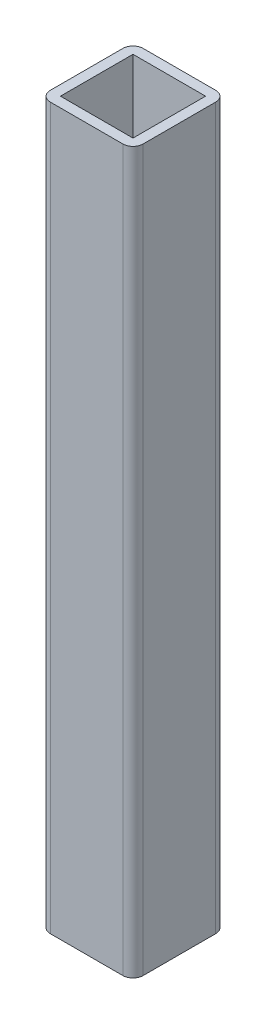
ISO-10303-21;
HEADER;
FILE_DESCRIPTION(('STEP AP214'),'2;1');
FILE_NAME('part.step','',(''),(''),'','','');
FILE_SCHEMA(('AUTOMOTIVE_DESIGN { 1 0 10303 214 1 1 1 1 }'));
ENDSEC;
DATA;
#1=APPLICATION_CONTEXT('core data for automotive mechanical design processes');
#2=APPLICATION_PROTOCOL_DEFINITION('international standard','automotive_design',2000,#1);
#3=PRODUCT_CONTEXT('',#1,'mechanical');
#4=PRODUCT('Part','Part','',(#3));
#5=PRODUCT_RELATED_PRODUCT_CATEGORY('part','',(#4));
#6=PRODUCT_DEFINITION_FORMATION('','',#4);
#7=PRODUCT_DEFINITION_CONTEXT('part definition',#1,'design');
#8=PRODUCT_DEFINITION('design','',#6,#7);
#9=PRODUCT_DEFINITION_SHAPE('','',#8);
#10=(LENGTH_UNIT() NAMED_UNIT(*) SI_UNIT(.MILLI.,.METRE.));
#11=(NAMED_UNIT(*) PLANE_ANGLE_UNIT() SI_UNIT($,.RADIAN.));
#12=(NAMED_UNIT(*) SI_UNIT($,.STERADIAN.) SOLID_ANGLE_UNIT());
#13=UNCERTAINTY_MEASURE_WITH_UNIT(LENGTH_MEASURE(1.E-05),#10,'distance_accuracy_value','');
#14=(GEOMETRIC_REPRESENTATION_CONTEXT(3) GLOBAL_UNCERTAINTY_ASSIGNED_CONTEXT((#13)) GLOBAL_UNIT_ASSIGNED_CONTEXT((#10,
#11,#12)) REPRESENTATION_CONTEXT('',''));
#15=CARTESIAN_POINT('',(0.,0.,0.));
#16=DIRECTION('',(0.,0.,1.));
#17=DIRECTION('',(1.,0.,0.));
#18=AXIS2_PLACEMENT_3D('',#15,#16,#17);
#19=CARTESIAN_POINT('',(22.8,198.5,2.8));
#20=DIRECTION('',(0.,-1.,0.));
#21=DIRECTION('',(0.,0.,-1.));
#22=AXIS2_PLACEMENT_3D('',#19,#20,#21);
#23=CYLINDRICAL_SURFACE('',#22,2.8);
#24=CARTESIAN_POINT('',(22.8,0.,2.8));
#25=DIRECTION('',(0.,1.,0.));
#26=DIRECTION('',(0.,0.,-1.));
#27=AXIS2_PLACEMENT_3D('',#24,#25,#26);
#28=CIRCLE('',#27,2.8);
#29=CARTESIAN_POINT('',(25.6,0.,2.80000000000002));
#30=VERTEX_POINT('',#29);
#31=CARTESIAN_POINT('',(22.8,0.,0.));
#32=VERTEX_POINT('',#31);
#33=EDGE_CURVE('E157',#30,#32,#28,.T.);
#34=ORIENTED_EDGE('',*,*,#33,.T.);
#35=DIRECTION('',(0.,-1.,0.));
#36=VECTOR('',#35,1.);
#37=CARTESIAN_POINT('',(22.8,198.5,0.));
#38=LINE('',#37,#36);
#39=CARTESIAN_POINT('',(22.8,198.5,0.));
#40=VERTEX_POINT('',#39);
#41=EDGE_CURVE('E11',#40,#32,#38,.T.);
#42=ORIENTED_EDGE('',*,*,#41,.F.);
#43=CARTESIAN_POINT('',(22.8,198.5,2.8));
#44=DIRECTION('',(0.,1.,0.));
#45=DIRECTION('',(0.,0.,-1.));
#46=AXIS2_PLACEMENT_3D('',#43,#44,#45);
#47=CIRCLE('',#46,2.8);
#48=CARTESIAN_POINT('',(25.6,198.5,2.80000000000002));
#49=VERTEX_POINT('',#48);
#50=EDGE_CURVE('E158',#49,#40,#47,.T.);
#51=ORIENTED_EDGE('',*,*,#50,.F.);
#52=DIRECTION('',(0.,-1.,0.));
#53=VECTOR('',#52,1.);
#54=CARTESIAN_POINT('',(25.6,198.5,2.80000000000002));
#55=LINE('',#54,#53);
#56=EDGE_CURVE('E176',#49,#30,#55,.T.);
#57=ORIENTED_EDGE('',*,*,#56,.T.);
#58=EDGE_LOOP('',(#34,#42,#51,#57));
#59=FACE_BOUND('',#58,.T.);
#60=ADVANCED_FACE('F32',(#59),#23,.T.);
#61=CARTESIAN_POINT('',(2.80000000000002,198.5,0.));
#62=DIRECTION('',(0.,0.,1.));
#63=DIRECTION('',(1.,0.,0.));
#64=AXIS2_PLACEMENT_3D('',#61,#62,#63);
#65=PLANE('',#64);
#66=DIRECTION('',(-1.,0.,0.));
#67=VECTOR('',#66,1.);
#68=CARTESIAN_POINT('',(2.80000000000002,0.,0.));
#69=LINE('',#68,#67);
#70=CARTESIAN_POINT('',(2.80000000000002,0.,0.));
#71=VERTEX_POINT('',#70);
#72=EDGE_CURVE('E179',#32,#71,#69,.T.);
#73=ORIENTED_EDGE('',*,*,#72,.T.);
#74=DIRECTION('',(0.,-1.,0.));
#75=VECTOR('',#74,1.);
#76=CARTESIAN_POINT('',(2.80000000000002,198.5,0.));
#77=LINE('',#76,#75);
#78=CARTESIAN_POINT('',(2.80000000000002,198.5,0.));
#79=VERTEX_POINT('',#78);
#80=EDGE_CURVE('E39',#79,#71,#77,.T.);
#81=ORIENTED_EDGE('',*,*,#80,.F.);
#82=DIRECTION('',(-1.,0.,0.));
#83=VECTOR('',#82,1.);
#84=CARTESIAN_POINT('',(2.80000000000002,198.5,0.));
#85=LINE('',#84,#83);
#86=EDGE_CURVE('E161',#40,#79,#85,.T.);
#87=ORIENTED_EDGE('',*,*,#86,.F.);
#88=ORIENTED_EDGE('',*,*,#41,.T.);
#89=EDGE_LOOP('',(#73,#81,#87,#88));
#90=FACE_BOUND('',#89,.T.);
#91=ADVANCED_FACE('F234',(#90),#65,.F.);
#92=CARTESIAN_POINT('',(2.8,198.5,2.8));
#93=DIRECTION('',(0.,-1.,0.));
#94=DIRECTION('',(0.,0.,-1.));
#95=AXIS2_PLACEMENT_3D('',#92,#93,#94);
#96=CYLINDRICAL_SURFACE('',#95,2.8);
#97=CARTESIAN_POINT('',(2.8,0.,2.8));
#98=DIRECTION('',(0.,1.,0.));
#99=DIRECTION('',(0.,0.,1.));
#100=AXIS2_PLACEMENT_3D('',#97,#98,#99);
#101=CIRCLE('',#100,2.8);
#102=CARTESIAN_POINT('',(0.,0.,2.80000000000002));
#103=VERTEX_POINT('',#102);
#104=EDGE_CURVE('E181',#71,#103,#101,.T.);
#105=ORIENTED_EDGE('',*,*,#104,.T.);
#106=DIRECTION('',(0.,-1.,0.));
#107=VECTOR('',#106,1.);
#108=CARTESIAN_POINT('',(0.,198.5,2.80000000000002));
#109=LINE('',#108,#107);
#110=CARTESIAN_POINT('',(0.,198.5,2.80000000000002));
#111=VERTEX_POINT('',#110);
#112=EDGE_CURVE('E206',#111,#103,#109,.T.);
#113=ORIENTED_EDGE('',*,*,#112,.F.);
#114=CARTESIAN_POINT('',(2.8,198.5,2.8));
#115=DIRECTION('',(0.,1.,0.));
#116=DIRECTION('',(0.,0.,1.));
#117=AXIS2_PLACEMENT_3D('',#114,#115,#116);
#118=CIRCLE('',#117,2.8);
#119=EDGE_CURVE('E164',#79,#111,#118,.T.);
#120=ORIENTED_EDGE('',*,*,#119,.F.);
#121=ORIENTED_EDGE('',*,*,#80,.T.);
#122=EDGE_LOOP('',(#105,#113,#120,#121));
#123=FACE_BOUND('',#122,.T.);
#124=ADVANCED_FACE('F213',(#123),#96,.T.);
#125=CARTESIAN_POINT('',(0.,198.5,2.80000000000002));
#126=DIRECTION('',(1.,0.,0.));
#127=DIRECTION('',(0.,0.,-1.));
#128=AXIS2_PLACEMENT_3D('',#125,#126,#127);
#129=PLANE('',#128);
#130=DIRECTION('',(0.,0.,1.));
#131=VECTOR('',#130,1.);
#132=CARTESIAN_POINT('',(0.,0.,2.80000000000002));
#133=LINE('',#132,#131);
#134=CARTESIAN_POINT('',(0.,0.,22.8));
#135=VERTEX_POINT('',#134);
#136=EDGE_CURVE('E183',#103,#135,#133,.T.);
#137=ORIENTED_EDGE('',*,*,#136,.T.);
#138=DIRECTION('',(0.,-1.,0.));
#139=VECTOR('',#138,1.);
#140=CARTESIAN_POINT('',(0.,198.5,22.8));
#141=LINE('',#140,#139);
#142=CARTESIAN_POINT('',(0.,198.5,22.8));
#143=VERTEX_POINT('',#142);
#144=EDGE_CURVE('E203',#143,#135,#141,.T.);
#145=ORIENTED_EDGE('',*,*,#144,.F.);
#146=DIRECTION('',(0.,0.,1.));
#147=VECTOR('',#146,1.);
#148=CARTESIAN_POINT('',(0.,198.5,2.80000000000002));
#149=LINE('',#148,#147);
#150=EDGE_CURVE('E166',#111,#143,#149,.T.);
#151=ORIENTED_EDGE('',*,*,#150,.F.);
#152=ORIENTED_EDGE('',*,*,#112,.T.);
#153=EDGE_LOOP('',(#137,#145,#151,#152));
#154=FACE_BOUND('',#153,.T.);
#155=ADVANCED_FACE('F222',(#154),#129,.F.);
#156=CARTESIAN_POINT('',(2.8,198.5,22.8));
#157=DIRECTION('',(0.,-1.,0.));
#158=DIRECTION('',(0.,0.,-1.));
#159=AXIS2_PLACEMENT_3D('',#156,#157,#158);
#160=CYLINDRICAL_SURFACE('',#159,2.8);
#161=CARTESIAN_POINT('',(2.8,0.,22.8));
#162=DIRECTION('',(0.,1.,0.));
#163=DIRECTION('',(0.,0.,1.));
#164=AXIS2_PLACEMENT_3D('',#161,#162,#163);
#165=CIRCLE('',#164,2.8);
#166=CARTESIAN_POINT('',(2.80000000000002,0.,25.6));
#167=VERTEX_POINT('',#166);
#168=EDGE_CURVE('E185',#135,#167,#165,.T.);
#169=ORIENTED_EDGE('',*,*,#168,.T.);
#170=DIRECTION('',(0.,-1.,0.));
#171=VECTOR('',#170,1.);
#172=CARTESIAN_POINT('',(2.80000000000002,198.5,25.6));
#173=LINE('',#172,#171);
#174=CARTESIAN_POINT('',(2.80000000000002,198.5,25.6));
#175=VERTEX_POINT('',#174);
#176=EDGE_CURVE('E200',#175,#167,#173,.T.);
#177=ORIENTED_EDGE('',*,*,#176,.F.);
#178=CARTESIAN_POINT('',(2.8,198.5,22.8));
#179=DIRECTION('',(0.,1.,0.));
#180=DIRECTION('',(0.,0.,1.));
#181=AXIS2_PLACEMENT_3D('',#178,#179,#180);
#182=CIRCLE('',#181,2.8);
#183=EDGE_CURVE('E168',#143,#175,#182,.T.);
#184=ORIENTED_EDGE('',*,*,#183,.F.);
#185=ORIENTED_EDGE('',*,*,#144,.T.);
#186=EDGE_LOOP('',(#169,#177,#184,#185));
#187=FACE_BOUND('',#186,.T.);
#188=ADVANCED_FACE('F226',(#187),#160,.T.);
#189=CARTESIAN_POINT('',(2.80000000000002,198.5,25.6));
#190=DIRECTION('',(0.,0.,-1.));
#191=DIRECTION('',(-1.,0.,0.));
#192=AXIS2_PLACEMENT_3D('',#189,#190,#191);
#193=PLANE('',#192);
#194=DIRECTION('',(1.,0.,0.));
#195=VECTOR('',#194,1.);
#196=CARTESIAN_POINT('',(2.80000000000002,0.,25.6));
#197=LINE('',#196,#195);
#198=CARTESIAN_POINT('',(22.8,0.,25.6));
#199=VERTEX_POINT('',#198);
#200=EDGE_CURVE('E187',#167,#199,#197,.T.);
#201=ORIENTED_EDGE('',*,*,#200,.T.);
#202=DIRECTION('',(0.,-1.,0.));
#203=VECTOR('',#202,1.);
#204=CARTESIAN_POINT('',(22.8,198.5,25.6));
#205=LINE('',#204,#203);
#206=CARTESIAN_POINT('',(22.8,198.5,25.6));
#207=VERTEX_POINT('',#206);
#208=EDGE_CURVE('E197',#207,#199,#205,.T.);
#209=ORIENTED_EDGE('',*,*,#208,.F.);
#210=DIRECTION('',(1.,0.,0.));
#211=VECTOR('',#210,1.);
#212=CARTESIAN_POINT('',(2.80000000000002,198.5,25.6));
#213=LINE('',#212,#211);
#214=EDGE_CURVE('E170',#175,#207,#213,.T.);
#215=ORIENTED_EDGE('',*,*,#214,.F.);
#216=ORIENTED_EDGE('',*,*,#176,.T.);
#217=EDGE_LOOP('',(#201,#209,#215,#216));
#218=FACE_BOUND('',#217,.T.);
#219=ADVANCED_FACE('F247',(#218),#193,.F.);
#220=CARTESIAN_POINT('',(22.8,198.5,22.8));
#221=DIRECTION('',(0.,-1.,0.));
#222=DIRECTION('',(0.,0.,-1.));
#223=AXIS2_PLACEMENT_3D('',#220,#221,#222);
#224=CYLINDRICAL_SURFACE('',#223,2.8);
#225=CARTESIAN_POINT('',(22.8,0.,22.8));
#226=DIRECTION('',(0.,1.,0.));
#227=DIRECTION('',(0.,0.,1.));
#228=AXIS2_PLACEMENT_3D('',#225,#226,#227);
#229=CIRCLE('',#228,2.8);
#230=CARTESIAN_POINT('',(25.6,0.,22.8));
#231=VERTEX_POINT('',#230);
#232=EDGE_CURVE('E189',#199,#231,#229,.T.);
#233=ORIENTED_EDGE('',*,*,#232,.T.);
#234=DIRECTION('',(0.,-1.,0.));
#235=VECTOR('',#234,1.);
#236=CARTESIAN_POINT('',(25.6,198.5,22.8));
#237=LINE('',#236,#235);
#238=CARTESIAN_POINT('',(25.6,198.5,22.8));
#239=VERTEX_POINT('',#238);
#240=EDGE_CURVE('E194',#239,#231,#237,.T.);
#241=ORIENTED_EDGE('',*,*,#240,.F.);
#242=CARTESIAN_POINT('',(22.8,198.5,22.8));
#243=DIRECTION('',(0.,1.,0.));
#244=DIRECTION('',(0.,0.,1.));
#245=AXIS2_PLACEMENT_3D('',#242,#243,#244);
#246=CIRCLE('',#245,2.8);
#247=EDGE_CURVE('E172',#207,#239,#246,.T.);
#248=ORIENTED_EDGE('',*,*,#247,.F.);
#249=ORIENTED_EDGE('',*,*,#208,.T.);
#250=EDGE_LOOP('',(#233,#241,#248,#249));
#251=FACE_BOUND('',#250,.T.);
#252=ADVANCED_FACE('F245',(#251),#224,.T.);
#253=CARTESIAN_POINT('',(25.6,198.5,2.80000000000002));
#254=DIRECTION('',(-1.,0.,0.));
#255=DIRECTION('',(0.,0.,1.));
#256=AXIS2_PLACEMENT_3D('',#253,#254,#255);
#257=PLANE('',#256);
#258=DIRECTION('',(0.,0.,-1.));
#259=VECTOR('',#258,1.);
#260=CARTESIAN_POINT('',(25.6,0.,2.80000000000002));
#261=LINE('',#260,#259);
#262=EDGE_CURVE('E162',#231,#30,#261,.T.);
#263=ORIENTED_EDGE('',*,*,#262,.T.);
#264=ORIENTED_EDGE('',*,*,#56,.F.);
#265=DIRECTION('',(0.,0.,-1.));
#266=VECTOR('',#265,1.);
#267=CARTESIAN_POINT('',(25.6,198.5,2.80000000000002));
#268=LINE('',#267,#266);
#269=EDGE_CURVE('E174',#239,#49,#268,.T.);
#270=ORIENTED_EDGE('',*,*,#269,.F.);
#271=ORIENTED_EDGE('',*,*,#240,.T.);
#272=EDGE_LOOP('',(#263,#264,#270,#271));
#273=FACE_BOUND('',#272,.T.);
#274=ADVANCED_FACE('F240',(#273),#257,.F.);
#275=CARTESIAN_POINT('',(22.8,198.5,2.8));
#276=DIRECTION('',(0.,-1.,0.));
#277=DIRECTION('',(0.,0.,-1.));
#278=AXIS2_PLACEMENT_3D('',#275,#276,#277);
#279=PLANE('',#278);
#280=DIRECTION('',(1.,0.,0.));
#281=VECTOR('',#280,1.);
#282=CARTESIAN_POINT('',(22.8,198.5,2.8));
#283=LINE('',#282,#281);
#284=CARTESIAN_POINT('',(2.8,198.5,2.8));
#285=VERTEX_POINT('',#284);
#286=CARTESIAN_POINT('',(22.8,198.5,2.8));
#287=VERTEX_POINT('',#286);
#288=EDGE_CURVE('E151',#285,#287,#283,.T.);
#289=ORIENTED_EDGE('',*,*,#288,.T.);
#290=DIRECTION('',(0.,0.,1.));
#291=VECTOR('',#290,1.);
#292=CARTESIAN_POINT('',(22.8,198.5,2.8));
#293=LINE('',#292,#291);
#294=CARTESIAN_POINT('',(22.8,198.5,22.8));
#295=VERTEX_POINT('',#294);
#296=EDGE_CURVE('E154',#287,#295,#293,.T.);
#297=ORIENTED_EDGE('',*,*,#296,.T.);
#298=DIRECTION('',(-1.,0.,0.));
#299=VECTOR('',#298,1.);
#300=CARTESIAN_POINT('',(22.8,198.5,22.8));
#301=LINE('',#300,#299);
#302=CARTESIAN_POINT('',(2.8,198.5,22.8));
#303=VERTEX_POINT('',#302);
#304=EDGE_CURVE('E146',#295,#303,#301,.T.);
#305=ORIENTED_EDGE('',*,*,#304,.T.);
#306=DIRECTION('',(0.,0.,-1.));
#307=VECTOR('',#306,1.);
#308=CARTESIAN_POINT('',(2.8,198.5,2.79999999999999));
#309=LINE('',#308,#307);
#310=EDGE_CURVE('E126',#303,#285,#309,.T.);
#311=ORIENTED_EDGE('',*,*,#310,.T.);
#312=EDGE_LOOP('',(#289,#297,#305,#311));
#313=FACE_BOUND('',#312,.T.);
#314=ORIENTED_EDGE('',*,*,#50,.T.);
#315=ORIENTED_EDGE('',*,*,#86,.T.);
#316=ORIENTED_EDGE('',*,*,#119,.T.);
#317=ORIENTED_EDGE('',*,*,#150,.T.);
#318=ORIENTED_EDGE('',*,*,#183,.T.);
#319=ORIENTED_EDGE('',*,*,#214,.T.);
#320=ORIENTED_EDGE('',*,*,#247,.T.);
#321=ORIENTED_EDGE('',*,*,#269,.T.);
#322=EDGE_LOOP('',(#314,#315,#316,#317,#318,#319,#320,#321));
#323=FACE_BOUND('',#322,.T.);
#324=ADVANCED_FACE('F230',(#313,#323),#279,.F.);
#325=CARTESIAN_POINT('',(22.8,0.,2.8));
#326=DIRECTION('',(0.,-1.,0.));
#327=DIRECTION('',(0.,0.,-1.));
#328=AXIS2_PLACEMENT_3D('',#325,#326,#327);
#329=PLANE('',#328);
#330=DIRECTION('',(0.,0.,1.));
#331=VECTOR('',#330,1.);
#332=CARTESIAN_POINT('',(22.8,0.,2.8));
#333=LINE('',#332,#331);
#334=CARTESIAN_POINT('',(22.8,0.,2.8));
#335=VERTEX_POINT('',#334);
#336=CARTESIAN_POINT('',(22.8,0.,22.8));
#337=VERTEX_POINT('',#336);
#338=EDGE_CURVE('E54',#335,#337,#333,.T.);
#339=ORIENTED_EDGE('',*,*,#338,.F.);
#340=DIRECTION('',(1.,0.,0.));
#341=VECTOR('',#340,1.);
#342=CARTESIAN_POINT('',(2.8,0.,2.8));
#343=LINE('',#342,#341);
#344=CARTESIAN_POINT('',(2.8,0.,2.8));
#345=VERTEX_POINT('',#344);
#346=EDGE_CURVE('E139',#345,#335,#343,.T.);
#347=ORIENTED_EDGE('',*,*,#346,.F.);
#348=DIRECTION('',(0.,0.,-1.));
#349=VECTOR('',#348,1.);
#350=CARTESIAN_POINT('',(2.8,0.,2.8));
#351=LINE('',#350,#349);
#352=CARTESIAN_POINT('',(2.8,0.,22.8));
#353=VERTEX_POINT('',#352);
#354=EDGE_CURVE('E123',#353,#345,#351,.T.);
#355=ORIENTED_EDGE('',*,*,#354,.F.);
#356=DIRECTION('',(-1.,0.,0.));
#357=VECTOR('',#356,1.);
#358=CARTESIAN_POINT('',(2.8,0.,22.8));
#359=LINE('',#358,#357);
#360=EDGE_CURVE('E132',#337,#353,#359,.T.);
#361=ORIENTED_EDGE('',*,*,#360,.F.);
#362=EDGE_LOOP('',(#339,#347,#355,#361));
#363=FACE_BOUND('',#362,.T.);
#364=ORIENTED_EDGE('',*,*,#33,.F.);
#365=ORIENTED_EDGE('',*,*,#262,.F.);
#366=ORIENTED_EDGE('',*,*,#232,.F.);
#367=ORIENTED_EDGE('',*,*,#200,.F.);
#368=ORIENTED_EDGE('',*,*,#168,.F.);
#369=ORIENTED_EDGE('',*,*,#136,.F.);
#370=ORIENTED_EDGE('',*,*,#104,.F.);
#371=ORIENTED_EDGE('',*,*,#72,.F.);
#372=EDGE_LOOP('',(#364,#365,#366,#367,#368,#369,#370,#371));
#373=FACE_BOUND('',#372,.T.);
#374=ADVANCED_FACE('F136',(#363,#373),#329,.T.);
#375=CARTESIAN_POINT('',(22.8,861.,2.8));
#376=DIRECTION('',(1.,0.,0.));
#377=DIRECTION('',(0.,0.,-1.));
#378=AXIS2_PLACEMENT_3D('',#375,#376,#377);
#379=PLANE('',#378);
#380=DIRECTION('',(0.,-1.,0.));
#381=VECTOR('',#380,1.);
#382=CARTESIAN_POINT('',(22.8,861.,2.8));
#383=LINE('',#382,#381);
#384=EDGE_CURVE('E144',#287,#335,#383,.T.);
#385=ORIENTED_EDGE('',*,*,#384,.T.);
#386=ORIENTED_EDGE('',*,*,#338,.T.);
#387=DIRECTION('',(0.,-1.,0.));
#388=VECTOR('',#387,1.);
#389=CARTESIAN_POINT('',(22.8,861.,22.8));
#390=LINE('',#389,#388);
#391=EDGE_CURVE('E129',#295,#337,#390,.T.);
#392=ORIENTED_EDGE('',*,*,#391,.F.);
#393=ORIENTED_EDGE('',*,*,#296,.F.);
#394=EDGE_LOOP('',(#385,#386,#392,#393));
#395=FACE_BOUND('',#394,.T.);
#396=ADVANCED_FACE('F310',(#395),#379,.F.);
#397=CARTESIAN_POINT('',(2.8,861.,2.8));
#398=DIRECTION('',(0.,0.,-1.));
#399=DIRECTION('',(-1.,0.,0.));
#400=AXIS2_PLACEMENT_3D('',#397,#398,#399);
#401=PLANE('',#400);
#402=DIRECTION('',(0.,-1.,0.));
#403=VECTOR('',#402,1.);
#404=CARTESIAN_POINT('',(2.8,861.,2.8));
#405=LINE('',#404,#403);
#406=EDGE_CURVE('E128',#285,#345,#405,.T.);
#407=ORIENTED_EDGE('',*,*,#406,.T.);
#408=ORIENTED_EDGE('',*,*,#346,.T.);
#409=ORIENTED_EDGE('',*,*,#384,.F.);
#410=ORIENTED_EDGE('',*,*,#288,.F.);
#411=EDGE_LOOP('',(#407,#408,#409,#410));
#412=FACE_BOUND('',#411,.T.);
#413=ADVANCED_FACE('F319',(#412),#401,.F.);
#414=CARTESIAN_POINT('',(2.8,861.,2.8));
#415=DIRECTION('',(-1.,0.,0.));
#416=DIRECTION('',(0.,0.,1.));
#417=AXIS2_PLACEMENT_3D('',#414,#415,#416);
#418=PLANE('',#417);
#419=DIRECTION('',(0.,-1.,0.));
#420=VECTOR('',#419,1.);
#421=CARTESIAN_POINT('',(2.8,861.,22.8));
#422=LINE('',#421,#420);
#423=EDGE_CURVE('E46',#303,#353,#422,.T.);
#424=ORIENTED_EDGE('',*,*,#423,.T.);
#425=ORIENTED_EDGE('',*,*,#354,.T.);
#426=ORIENTED_EDGE('',*,*,#406,.F.);
#427=ORIENTED_EDGE('',*,*,#310,.F.);
#428=EDGE_LOOP('',(#424,#425,#426,#427));
#429=FACE_BOUND('',#428,.T.);
#430=ADVANCED_FACE('F120',(#429),#418,.F.);
#431=CARTESIAN_POINT('',(2.8,861.,22.8));
#432=DIRECTION('',(0.,0.,1.));
#433=DIRECTION('',(1.,0.,0.));
#434=AXIS2_PLACEMENT_3D('',#431,#432,#433);
#435=PLANE('',#434);
#436=ORIENTED_EDGE('',*,*,#391,.T.);
#437=ORIENTED_EDGE('',*,*,#360,.T.);
#438=ORIENTED_EDGE('',*,*,#423,.F.);
#439=ORIENTED_EDGE('',*,*,#304,.F.);
#440=EDGE_LOOP('',(#436,#437,#438,#439));
#441=FACE_BOUND('',#440,.T.);
#442=ADVANCED_FACE('F133',(#441),#435,.F.);
#443=CLOSED_SHELL('',(#60,#91,#124,#155,#188,#219,#252,#274,#324,#374,#396,#413,#430,#442));
#444=MANIFOLD_SOLID_BREP('B2',#443);
#445=ADVANCED_BREP_SHAPE_REPRESENTATION('',(#18,#444),#14);
#446=SHAPE_DEFINITION_REPRESENTATION(#9,#445);
ENDSEC;
END-ISO-10303-21;
